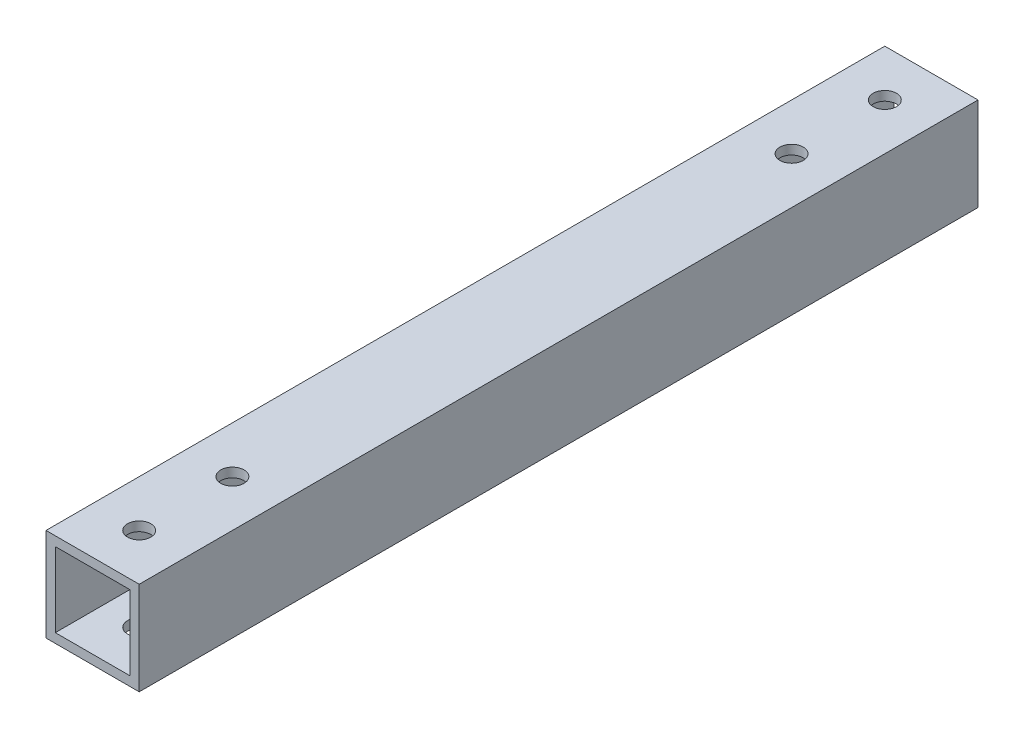
ISO-10303-21;
HEADER;
FILE_DESCRIPTION(('STEP AP214'),'2;1');
FILE_NAME('part.step','',(''),(''),'','','');
FILE_SCHEMA(('AUTOMOTIVE_DESIGN { 1 0 10303 214 1 1 1 1 }'));
ENDSEC;
DATA;
#1=APPLICATION_CONTEXT('core data for automotive mechanical design processes');
#2=APPLICATION_PROTOCOL_DEFINITION('international standard','automotive_design',2000,#1);
#3=PRODUCT_CONTEXT('',#1,'mechanical');
#4=PRODUCT('Part','Part','',(#3));
#5=PRODUCT_RELATED_PRODUCT_CATEGORY('part','',(#4));
#6=PRODUCT_DEFINITION_FORMATION('','',#4);
#7=PRODUCT_DEFINITION_CONTEXT('part definition',#1,'design');
#8=PRODUCT_DEFINITION('design','',#6,#7);
#9=PRODUCT_DEFINITION_SHAPE('','',#8);
#10=(LENGTH_UNIT() NAMED_UNIT(*) SI_UNIT(.MILLI.,.METRE.));
#11=(NAMED_UNIT(*) PLANE_ANGLE_UNIT() SI_UNIT($,.RADIAN.));
#12=(NAMED_UNIT(*) SI_UNIT($,.STERADIAN.) SOLID_ANGLE_UNIT());
#13=UNCERTAINTY_MEASURE_WITH_UNIT(LENGTH_MEASURE(1.E-05),#10,'distance_accuracy_value','');
#14=(GEOMETRIC_REPRESENTATION_CONTEXT(3) GLOBAL_UNCERTAINTY_ASSIGNED_CONTEXT((#13)) GLOBAL_UNIT_ASSIGNED_CONTEXT((#10,
#11,#12)) REPRESENTATION_CONTEXT('',''));
#15=CARTESIAN_POINT('',(0.,0.,0.));
#16=DIRECTION('',(0.,0.,1.));
#17=DIRECTION('',(1.,0.,0.));
#18=AXIS2_PLACEMENT_3D('',#15,#16,#17);
#19=CARTESIAN_POINT('',(0.,0.,180.));
#20=DIRECTION('',(0.,0.,1.));
#21=DIRECTION('',(1.,0.,0.));
#22=AXIS2_PLACEMENT_3D('',#19,#20,#21);
#23=PLANE('',#22);
#24=DIRECTION('',(0.,1.,0.));
#25=VECTOR('',#24,1.);
#26=CARTESIAN_POINT('',(10.,10.,180.));
#27=LINE('',#26,#25);
#28=CARTESIAN_POINT('',(10.,-10.,180.));
#29=VERTEX_POINT('',#28);
#30=CARTESIAN_POINT('',(10.,10.,180.));
#31=VERTEX_POINT('',#30);
#32=EDGE_CURVE('E143',#29,#31,#27,.T.);
#33=ORIENTED_EDGE('',*,*,#32,.T.);
#34=DIRECTION('',(-1.,0.,0.));
#35=VECTOR('',#34,1.);
#36=CARTESIAN_POINT('',(-10.,10.,180.));
#37=LINE('',#36,#35);
#38=CARTESIAN_POINT('',(-10.,10.,180.));
#39=VERTEX_POINT('',#38);
#40=EDGE_CURVE('E146',#31,#39,#37,.T.);
#41=ORIENTED_EDGE('',*,*,#40,.T.);
#42=DIRECTION('',(0.,-1.,0.));
#43=VECTOR('',#42,1.);
#44=CARTESIAN_POINT('',(-10.,10.,180.));
#45=LINE('',#44,#43);
#46=CARTESIAN_POINT('',(-10.,-10.,180.));
#47=VERTEX_POINT('',#46);
#48=EDGE_CURVE('E149',#39,#47,#45,.T.);
#49=ORIENTED_EDGE('',*,*,#48,.T.);
#50=DIRECTION('',(1.,0.,0.));
#51=VECTOR('',#50,1.);
#52=CARTESIAN_POINT('',(-10.,-10.,180.));
#53=LINE('',#52,#51);
#54=EDGE_CURVE('E151',#47,#29,#53,.T.);
#55=ORIENTED_EDGE('',*,*,#54,.T.);
#56=EDGE_LOOP('',(#33,#41,#49,#55));
#57=FACE_BOUND('',#56,.T.);
#58=DIRECTION('',(-1.,0.,0.));
#59=VECTOR('',#58,1.);
#60=CARTESIAN_POINT('',(-8.,8.,180.));
#61=LINE('',#60,#59);
#62=CARTESIAN_POINT('',(8.,8.,180.));
#63=VERTEX_POINT('',#62);
#64=CARTESIAN_POINT('',(-8.,8.,180.));
#65=VERTEX_POINT('',#64);
#66=EDGE_CURVE('E113',#63,#65,#61,.T.);
#67=ORIENTED_EDGE('',*,*,#66,.F.);
#68=DIRECTION('',(0.,1.,0.));
#69=VECTOR('',#68,1.);
#70=CARTESIAN_POINT('',(8.,8.,180.));
#71=LINE('',#70,#69);
#72=CARTESIAN_POINT('',(8.,-8.00000000000001,180.));
#73=VERTEX_POINT('',#72);
#74=EDGE_CURVE('E105',#73,#63,#71,.T.);
#75=ORIENTED_EDGE('',*,*,#74,.F.);
#76=DIRECTION('',(1.,0.,0.));
#77=VECTOR('',#76,1.);
#78=CARTESIAN_POINT('',(-8.,-8.00000000000001,180.));
#79=LINE('',#78,#77);
#80=CARTESIAN_POINT('',(-8.,-8.00000000000001,180.));
#81=VERTEX_POINT('',#80);
#82=EDGE_CURVE('E127',#81,#73,#79,.T.);
#83=ORIENTED_EDGE('',*,*,#82,.F.);
#84=DIRECTION('',(0.,-1.,0.));
#85=VECTOR('',#84,1.);
#86=CARTESIAN_POINT('',(-8.,8.,180.));
#87=LINE('',#86,#85);
#88=EDGE_CURVE('E125',#65,#81,#87,.T.);
#89=ORIENTED_EDGE('',*,*,#88,.F.);
#90=EDGE_LOOP('',(#67,#75,#83,#89));
#91=FACE_BOUND('',#90,.T.);
#92=ADVANCED_FACE('F38',(#57,#91),#23,.T.);
#93=CARTESIAN_POINT('',(0.,0.,0.));
#94=DIRECTION('',(0.,0.,1.));
#95=DIRECTION('',(1.,0.,0.));
#96=AXIS2_PLACEMENT_3D('',#93,#94,#95);
#97=PLANE('',#96);
#98=DIRECTION('',(0.,1.,0.));
#99=VECTOR('',#98,1.);
#100=CARTESIAN_POINT('',(10.,10.,0.));
#101=LINE('',#100,#99);
#102=CARTESIAN_POINT('',(10.,-10.,0.));
#103=VERTEX_POINT('',#102);
#104=CARTESIAN_POINT('',(10.,10.,0.));
#105=VERTEX_POINT('',#104);
#106=EDGE_CURVE('E121',#103,#105,#101,.T.);
#107=ORIENTED_EDGE('',*,*,#106,.F.);
#108=DIRECTION('',(1.,0.,0.));
#109=VECTOR('',#108,1.);
#110=CARTESIAN_POINT('',(-10.,-10.,0.));
#111=LINE('',#110,#109);
#112=CARTESIAN_POINT('',(-10.,-10.,0.));
#113=VERTEX_POINT('',#112);
#114=EDGE_CURVE('E147',#113,#103,#111,.T.);
#115=ORIENTED_EDGE('',*,*,#114,.F.);
#116=DIRECTION('',(0.,-1.,0.));
#117=VECTOR('',#116,1.);
#118=CARTESIAN_POINT('',(-10.,10.,0.));
#119=LINE('',#118,#117);
#120=CARTESIAN_POINT('',(-10.,10.,0.));
#121=VERTEX_POINT('',#120);
#122=EDGE_CURVE('E158',#121,#113,#119,.T.);
#123=ORIENTED_EDGE('',*,*,#122,.F.);
#124=DIRECTION('',(-1.,0.,0.));
#125=VECTOR('',#124,1.);
#126=CARTESIAN_POINT('',(-10.,10.,0.));
#127=LINE('',#126,#125);
#128=EDGE_CURVE('E156',#105,#121,#127,.T.);
#129=ORIENTED_EDGE('',*,*,#128,.F.);
#130=EDGE_LOOP('',(#107,#115,#123,#129));
#131=FACE_BOUND('',#130,.T.);
#132=DIRECTION('',(0.,1.,0.));
#133=VECTOR('',#132,1.);
#134=CARTESIAN_POINT('',(8.,8.,0.));
#135=LINE('',#134,#133);
#136=CARTESIAN_POINT('',(8.,-8.00000000000001,0.));
#137=VERTEX_POINT('',#136);
#138=CARTESIAN_POINT('',(8.,8.,0.));
#139=VERTEX_POINT('',#138);
#140=EDGE_CURVE('E63',#137,#139,#135,.T.);
#141=ORIENTED_EDGE('',*,*,#140,.T.);
#142=DIRECTION('',(-1.,0.,0.));
#143=VECTOR('',#142,1.);
#144=CARTESIAN_POINT('',(-8.,8.,0.));
#145=LINE('',#144,#143);
#146=CARTESIAN_POINT('',(-8.,8.,0.));
#147=VERTEX_POINT('',#146);
#148=EDGE_CURVE('E120',#139,#147,#145,.T.);
#149=ORIENTED_EDGE('',*,*,#148,.T.);
#150=DIRECTION('',(0.,-1.,0.));
#151=VECTOR('',#150,1.);
#152=CARTESIAN_POINT('',(-8.,8.,0.));
#153=LINE('',#152,#151);
#154=CARTESIAN_POINT('',(-8.,-8.00000000000001,0.));
#155=VERTEX_POINT('',#154);
#156=EDGE_CURVE('E135',#147,#155,#153,.T.);
#157=ORIENTED_EDGE('',*,*,#156,.T.);
#158=DIRECTION('',(1.,0.,0.));
#159=VECTOR('',#158,1.);
#160=CARTESIAN_POINT('',(-8.,-8.00000000000001,0.));
#161=LINE('',#160,#159);
#162=EDGE_CURVE('E114',#155,#137,#161,.T.);
#163=ORIENTED_EDGE('',*,*,#162,.T.);
#164=EDGE_LOOP('',(#141,#149,#157,#163));
#165=FACE_BOUND('',#164,.T.);
#166=ADVANCED_FACE('F210',(#131,#165),#97,.F.);
#167=CARTESIAN_POINT('',(10.,10.,180.));
#168=DIRECTION('',(-1.,0.,0.));
#169=DIRECTION('',(0.,0.,1.));
#170=AXIS2_PLACEMENT_3D('',#167,#168,#169);
#171=PLANE('',#170);
#172=ORIENTED_EDGE('',*,*,#106,.T.);
#173=DIRECTION('',(0.,0.,-1.));
#174=VECTOR('',#173,1.);
#175=CARTESIAN_POINT('',(10.,10.,180.));
#176=LINE('',#175,#174);
#177=EDGE_CURVE('E11',#31,#105,#176,.T.);
#178=ORIENTED_EDGE('',*,*,#177,.F.);
#179=ORIENTED_EDGE('',*,*,#32,.F.);
#180=DIRECTION('',(0.,0.,-1.));
#181=VECTOR('',#180,1.);
#182=CARTESIAN_POINT('',(10.,-10.,180.));
#183=LINE('',#182,#181);
#184=EDGE_CURVE('E153',#29,#103,#183,.T.);
#185=ORIENTED_EDGE('',*,*,#184,.T.);
#186=EDGE_LOOP('',(#172,#178,#179,#185));
#187=FACE_BOUND('',#186,.T.);
#188=ADVANCED_FACE('F40',(#187),#171,.F.);
#189=CARTESIAN_POINT('',(-10.,10.,180.));
#190=DIRECTION('',(0.,-1.,0.));
#191=DIRECTION('',(1.,0.,0.));
#192=AXIS2_PLACEMENT_3D('',#189,#190,#191);
#193=PLANE('',#192);
#194=CARTESIAN_POINT('',(0.,10.,10.));
#195=DIRECTION('',(0.,1.,0.));
#196=DIRECTION('',(-1.,0.,0.));
#197=AXIS2_PLACEMENT_3D('',#194,#195,#196);
#198=CIRCLE('',#197,2.5);
#199=CARTESIAN_POINT('',(-2.5,10.,10.));
#200=VERTEX_POINT('',#199);
#201=EDGE_CURVE('E248',#200,#200,#198,.T.);
#202=ORIENTED_EDGE('',*,*,#201,.F.);
#203=EDGE_LOOP('',(#202));
#204=FACE_BOUND('',#203,.T.);
#205=CARTESIAN_POINT('',(0.,10.,30.));
#206=DIRECTION('',(0.,1.,0.));
#207=DIRECTION('',(-1.,0.,0.));
#208=AXIS2_PLACEMENT_3D('',#205,#206,#207);
#209=CIRCLE('',#208,2.5);
#210=CARTESIAN_POINT('',(-2.5,10.,30.));
#211=VERTEX_POINT('',#210);
#212=EDGE_CURVE('E252',#211,#211,#209,.T.);
#213=ORIENTED_EDGE('',*,*,#212,.F.);
#214=EDGE_LOOP('',(#213));
#215=FACE_BOUND('',#214,.T.);
#216=CARTESIAN_POINT('',(0.,10.,150.));
#217=DIRECTION('',(0.,1.,0.));
#218=DIRECTION('',(1.,0.,0.));
#219=AXIS2_PLACEMENT_3D('',#216,#217,#218);
#220=CIRCLE('',#219,2.5);
#221=CARTESIAN_POINT('',(2.5,10.,150.));
#222=VERTEX_POINT('',#221);
#223=EDGE_CURVE('E256',#222,#222,#220,.T.);
#224=ORIENTED_EDGE('',*,*,#223,.F.);
#225=EDGE_LOOP('',(#224));
#226=FACE_BOUND('',#225,.T.);
#227=CARTESIAN_POINT('',(0.,10.,170.));
#228=DIRECTION('',(0.,1.,0.));
#229=DIRECTION('',(1.,0.,0.));
#230=AXIS2_PLACEMENT_3D('',#227,#228,#229);
#231=CIRCLE('',#230,2.49999999999999);
#232=CARTESIAN_POINT('',(2.49999999999999,10.,170.));
#233=VERTEX_POINT('',#232);
#234=EDGE_CURVE('E260',#233,#233,#231,.T.);
#235=ORIENTED_EDGE('',*,*,#234,.F.);
#236=EDGE_LOOP('',(#235));
#237=FACE_BOUND('',#236,.T.);
#238=ORIENTED_EDGE('',*,*,#128,.T.);
#239=DIRECTION('',(0.,0.,-1.));
#240=VECTOR('',#239,1.);
#241=CARTESIAN_POINT('',(-10.,10.,180.));
#242=LINE('',#241,#240);
#243=EDGE_CURVE('E47',#39,#121,#242,.T.);
#244=ORIENTED_EDGE('',*,*,#243,.F.);
#245=ORIENTED_EDGE('',*,*,#40,.F.);
#246=ORIENTED_EDGE('',*,*,#177,.T.);
#247=EDGE_LOOP('',(#238,#244,#245,#246));
#248=FACE_BOUND('',#247,.T.);
#249=ADVANCED_FACE('F237',(#204,#215,#226,#237,#248),#193,.F.);
#250=CARTESIAN_POINT('',(-10.,10.,180.));
#251=DIRECTION('',(1.,0.,0.));
#252=DIRECTION('',(0.,0.,-1.));
#253=AXIS2_PLACEMENT_3D('',#250,#251,#252);
#254=PLANE('',#253);
#255=ORIENTED_EDGE('',*,*,#122,.T.);
#256=DIRECTION('',(0.,0.,-1.));
#257=VECTOR('',#256,1.);
#258=CARTESIAN_POINT('',(-10.,-10.,180.));
#259=LINE('',#258,#257);
#260=EDGE_CURVE('E163',#47,#113,#259,.T.);
#261=ORIENTED_EDGE('',*,*,#260,.F.);
#262=ORIENTED_EDGE('',*,*,#48,.F.);
#263=ORIENTED_EDGE('',*,*,#243,.T.);
#264=EDGE_LOOP('',(#255,#261,#262,#263));
#265=FACE_BOUND('',#264,.T.);
#266=ADVANCED_FACE('F234',(#265),#254,.F.);
#267=CARTESIAN_POINT('',(-10.,-10.,180.));
#268=DIRECTION('',(0.,1.,0.));
#269=DIRECTION('',(0.,0.,1.));
#270=AXIS2_PLACEMENT_3D('',#267,#268,#269);
#271=PLANE('',#270);
#272=CARTESIAN_POINT('',(0.,-10.,10.));
#273=DIRECTION('',(0.,1.,0.));
#274=DIRECTION('',(-1.,0.,0.));
#275=AXIS2_PLACEMENT_3D('',#272,#273,#274);
#276=CIRCLE('',#275,2.5);
#277=CARTESIAN_POINT('',(-2.5,-10.,10.));
#278=VERTEX_POINT('',#277);
#279=EDGE_CURVE('E172',#278,#278,#276,.T.);
#280=ORIENTED_EDGE('',*,*,#279,.T.);
#281=EDGE_LOOP('',(#280));
#282=FACE_BOUND('',#281,.T.);
#283=CARTESIAN_POINT('',(0.,-10.,30.));
#284=DIRECTION('',(0.,1.,0.));
#285=DIRECTION('',(-1.,0.,0.));
#286=AXIS2_PLACEMENT_3D('',#283,#284,#285);
#287=CIRCLE('',#286,2.5);
#288=CARTESIAN_POINT('',(-2.49999999999999,-10.,30.));
#289=VERTEX_POINT('',#288);
#290=EDGE_CURVE('E282',#289,#289,#287,.T.);
#291=ORIENTED_EDGE('',*,*,#290,.T.);
#292=EDGE_LOOP('',(#291));
#293=FACE_BOUND('',#292,.T.);
#294=CARTESIAN_POINT('',(0.,-10.,150.));
#295=DIRECTION('',(0.,1.,0.));
#296=DIRECTION('',(1.,0.,0.));
#297=AXIS2_PLACEMENT_3D('',#294,#295,#296);
#298=CIRCLE('',#297,2.5);
#299=CARTESIAN_POINT('',(2.50000000000001,-10.,150.));
#300=VERTEX_POINT('',#299);
#301=EDGE_CURVE('E278',#300,#300,#298,.T.);
#302=ORIENTED_EDGE('',*,*,#301,.T.);
#303=EDGE_LOOP('',(#302));
#304=FACE_BOUND('',#303,.T.);
#305=CARTESIAN_POINT('',(0.,-10.,170.));
#306=DIRECTION('',(0.,1.,0.));
#307=DIRECTION('',(1.,0.,0.));
#308=AXIS2_PLACEMENT_3D('',#305,#306,#307);
#309=CIRCLE('',#308,2.49999999999999);
#310=CARTESIAN_POINT('',(2.5,-10.,170.));
#311=VERTEX_POINT('',#310);
#312=EDGE_CURVE('E273',#311,#311,#309,.T.);
#313=ORIENTED_EDGE('',*,*,#312,.T.);
#314=EDGE_LOOP('',(#313));
#315=FACE_BOUND('',#314,.T.);
#316=ORIENTED_EDGE('',*,*,#114,.T.);
#317=ORIENTED_EDGE('',*,*,#184,.F.);
#318=ORIENTED_EDGE('',*,*,#54,.F.);
#319=ORIENTED_EDGE('',*,*,#260,.T.);
#320=EDGE_LOOP('',(#316,#317,#318,#319));
#321=FACE_BOUND('',#320,.T.);
#322=ADVANCED_FACE('F231',(#282,#293,#304,#315,#321),#271,.F.);
#323=CARTESIAN_POINT('',(8.,8.,180.));
#324=DIRECTION('',(-1.,0.,0.));
#325=DIRECTION('',(0.,0.,1.));
#326=AXIS2_PLACEMENT_3D('',#323,#324,#325);
#327=PLANE('',#326);
#328=ORIENTED_EDGE('',*,*,#140,.F.);
#329=DIRECTION('',(0.,0.,-1.));
#330=VECTOR('',#329,1.);
#331=CARTESIAN_POINT('',(8.,-8.00000000000001,180.));
#332=LINE('',#331,#330);
#333=EDGE_CURVE('E109',#73,#137,#332,.T.);
#334=ORIENTED_EDGE('',*,*,#333,.F.);
#335=ORIENTED_EDGE('',*,*,#74,.T.);
#336=DIRECTION('',(0.,0.,-1.));
#337=VECTOR('',#336,1.);
#338=CARTESIAN_POINT('',(8.,8.,180.));
#339=LINE('',#338,#337);
#340=EDGE_CURVE('E108',#63,#139,#339,.T.);
#341=ORIENTED_EDGE('',*,*,#340,.T.);
#342=EDGE_LOOP('',(#328,#334,#335,#341));
#343=FACE_BOUND('',#342,.T.);
#344=ADVANCED_FACE('F107',(#343),#327,.T.);
#345=CARTESIAN_POINT('',(-8.,8.,180.));
#346=DIRECTION('',(0.,-1.,0.));
#347=DIRECTION('',(0.,0.,-1.));
#348=AXIS2_PLACEMENT_3D('',#345,#346,#347);
#349=PLANE('',#348);
#350=CARTESIAN_POINT('',(0.,8.00000000000001,10.));
#351=DIRECTION('',(0.,-1.,0.));
#352=DIRECTION('',(0.,0.,-1.));
#353=AXIS2_PLACEMENT_3D('',#350,#351,#352);
#354=CIRCLE('',#353,2.5);
#355=CARTESIAN_POINT('',(0.,8.00000000000001,7.5));
#356=VERTEX_POINT('',#355);
#357=EDGE_CURVE('E133',#356,#356,#354,.T.);
#358=ORIENTED_EDGE('',*,*,#357,.F.);
#359=EDGE_LOOP('',(#358));
#360=FACE_BOUND('',#359,.T.);
#361=CARTESIAN_POINT('',(0.,8.00000000000001,30.));
#362=DIRECTION('',(0.,-1.,0.));
#363=DIRECTION('',(0.,0.,-1.));
#364=AXIS2_PLACEMENT_3D('',#361,#362,#363);
#365=CIRCLE('',#364,2.5);
#366=CARTESIAN_POINT('',(0.,8.00000000000001,27.5));
#367=VERTEX_POINT('',#366);
#368=EDGE_CURVE('E178',#367,#367,#365,.T.);
#369=ORIENTED_EDGE('',*,*,#368,.F.);
#370=EDGE_LOOP('',(#369));
#371=FACE_BOUND('',#370,.T.);
#372=CARTESIAN_POINT('',(0.,8.00000000000001,150.));
#373=DIRECTION('',(0.,-1.,0.));
#374=DIRECTION('',(0.,0.,-1.));
#375=AXIS2_PLACEMENT_3D('',#372,#373,#374);
#376=CIRCLE('',#375,2.5);
#377=CARTESIAN_POINT('',(0.,8.00000000000001,147.5));
#378=VERTEX_POINT('',#377);
#379=EDGE_CURVE('E175',#378,#378,#376,.T.);
#380=ORIENTED_EDGE('',*,*,#379,.F.);
#381=EDGE_LOOP('',(#380));
#382=FACE_BOUND('',#381,.T.);
#383=CARTESIAN_POINT('',(0.,8.00000000000001,170.));
#384=DIRECTION('',(0.,-1.,0.));
#385=DIRECTION('',(0.,0.,-1.));
#386=AXIS2_PLACEMENT_3D('',#383,#384,#385);
#387=CIRCLE('',#386,2.49999999999999);
#388=CARTESIAN_POINT('',(0.,8.00000000000001,167.5));
#389=VERTEX_POINT('',#388);
#390=EDGE_CURVE('E171',#389,#389,#387,.T.);
#391=ORIENTED_EDGE('',*,*,#390,.F.);
#392=EDGE_LOOP('',(#391));
#393=FACE_BOUND('',#392,.T.);
#394=ORIENTED_EDGE('',*,*,#148,.F.);
#395=ORIENTED_EDGE('',*,*,#340,.F.);
#396=ORIENTED_EDGE('',*,*,#66,.T.);
#397=DIRECTION('',(0.,0.,-1.));
#398=VECTOR('',#397,1.);
#399=CARTESIAN_POINT('',(-8.,8.,180.));
#400=LINE('',#399,#398);
#401=EDGE_CURVE('E122',#65,#147,#400,.T.);
#402=ORIENTED_EDGE('',*,*,#401,.T.);
#403=EDGE_LOOP('',(#394,#395,#396,#402));
#404=FACE_BOUND('',#403,.T.);
#405=ADVANCED_FACE('F117',(#360,#371,#382,#393,#404),#349,.T.);
#406=CARTESIAN_POINT('',(-8.,8.,180.));
#407=DIRECTION('',(1.,0.,0.));
#408=DIRECTION('',(0.,0.,-1.));
#409=AXIS2_PLACEMENT_3D('',#406,#407,#408);
#410=PLANE('',#409);
#411=ORIENTED_EDGE('',*,*,#156,.F.);
#412=ORIENTED_EDGE('',*,*,#401,.F.);
#413=ORIENTED_EDGE('',*,*,#88,.T.);
#414=DIRECTION('',(0.,0.,-1.));
#415=VECTOR('',#414,1.);
#416=CARTESIAN_POINT('',(-8.,-8.00000000000001,180.));
#417=LINE('',#416,#415);
#418=EDGE_CURVE('E55',#81,#155,#417,.T.);
#419=ORIENTED_EDGE('',*,*,#418,.T.);
#420=EDGE_LOOP('',(#411,#412,#413,#419));
#421=FACE_BOUND('',#420,.T.);
#422=ADVANCED_FACE('F202',(#421),#410,.T.);
#423=CARTESIAN_POINT('',(-8.,-8.00000000000001,180.));
#424=DIRECTION('',(0.,1.,0.));
#425=DIRECTION('',(0.,0.,1.));
#426=AXIS2_PLACEMENT_3D('',#423,#424,#425);
#427=PLANE('',#426);
#428=CARTESIAN_POINT('',(0.,-8.00000000000001,10.));
#429=DIRECTION('',(0.,1.,0.));
#430=DIRECTION('',(0.,0.,1.));
#431=AXIS2_PLACEMENT_3D('',#428,#429,#430);
#432=CIRCLE('',#431,2.5);
#433=CARTESIAN_POINT('',(0.,-8.00000000000001,12.5));
#434=VERTEX_POINT('',#433);
#435=EDGE_CURVE('E42',#434,#434,#432,.T.);
#436=ORIENTED_EDGE('',*,*,#435,.F.);
#437=EDGE_LOOP('',(#436));
#438=FACE_BOUND('',#437,.T.);
#439=CARTESIAN_POINT('',(0.,-8.00000000000001,30.));
#440=DIRECTION('',(0.,1.,0.));
#441=DIRECTION('',(0.,0.,1.));
#442=AXIS2_PLACEMENT_3D('',#439,#440,#441);
#443=CIRCLE('',#442,2.5);
#444=CARTESIAN_POINT('',(0.,-8.00000000000001,32.5));
#445=VERTEX_POINT('',#444);
#446=EDGE_CURVE('E176',#445,#445,#443,.T.);
#447=ORIENTED_EDGE('',*,*,#446,.F.);
#448=EDGE_LOOP('',(#447));
#449=FACE_BOUND('',#448,.T.);
#450=CARTESIAN_POINT('',(0.,-8.00000000000001,150.));
#451=DIRECTION('',(0.,1.,0.));
#452=DIRECTION('',(0.,0.,1.));
#453=AXIS2_PLACEMENT_3D('',#450,#451,#452);
#454=CIRCLE('',#453,2.5);
#455=CARTESIAN_POINT('',(0.,-8.00000000000001,152.5));
#456=VERTEX_POINT('',#455);
#457=EDGE_CURVE('E173',#456,#456,#454,.T.);
#458=ORIENTED_EDGE('',*,*,#457,.F.);
#459=EDGE_LOOP('',(#458));
#460=FACE_BOUND('',#459,.T.);
#461=CARTESIAN_POINT('',(0.,-8.00000000000001,170.));
#462=DIRECTION('',(0.,1.,0.));
#463=DIRECTION('',(0.,0.,1.));
#464=AXIS2_PLACEMENT_3D('',#461,#462,#463);
#465=CIRCLE('',#464,2.49999999999999);
#466=CARTESIAN_POINT('',(0.,-8.00000000000001,172.5));
#467=VERTEX_POINT('',#466);
#468=EDGE_CURVE('E168',#467,#467,#465,.T.);
#469=ORIENTED_EDGE('',*,*,#468,.F.);
#470=EDGE_LOOP('',(#469));
#471=FACE_BOUND('',#470,.T.);
#472=ORIENTED_EDGE('',*,*,#162,.F.);
#473=ORIENTED_EDGE('',*,*,#418,.F.);
#474=ORIENTED_EDGE('',*,*,#82,.T.);
#475=ORIENTED_EDGE('',*,*,#333,.T.);
#476=EDGE_LOOP('',(#472,#473,#474,#475));
#477=FACE_BOUND('',#476,.T.);
#478=ADVANCED_FACE('F198',(#438,#449,#460,#471,#477),#427,.T.);
#479=CARTESIAN_POINT('',(0.,-10.,170.));
#480=DIRECTION('',(0.,1.,0.));
#481=DIRECTION('',(-1.,0.,0.));
#482=AXIS2_PLACEMENT_3D('',#479,#480,#481);
#483=CYLINDRICAL_SURFACE('',#482,2.49999999999999);
#484=ORIENTED_EDGE('',*,*,#468,.T.);
#485=EDGE_LOOP('',(#484));
#486=FACE_BOUND('',#485,.T.);
#487=ORIENTED_EDGE('',*,*,#312,.F.);
#488=EDGE_LOOP('',(#487));
#489=FACE_BOUND('',#488,.T.);
#490=ADVANCED_FACE('F201',(#486,#489),#483,.F.);
#491=CARTESIAN_POINT('',(0.,-10.,150.));
#492=DIRECTION('',(0.,1.,0.));
#493=DIRECTION('',(-1.,0.,0.));
#494=AXIS2_PLACEMENT_3D('',#491,#492,#493);
#495=CYLINDRICAL_SURFACE('',#494,2.5);
#496=ORIENTED_EDGE('',*,*,#457,.T.);
#497=EDGE_LOOP('',(#496));
#498=FACE_BOUND('',#497,.T.);
#499=ORIENTED_EDGE('',*,*,#301,.F.);
#500=EDGE_LOOP('',(#499));
#501=FACE_BOUND('',#500,.T.);
#502=ADVANCED_FACE('F301',(#498,#501),#495,.F.);
#503=CARTESIAN_POINT('',(0.,-10.,30.));
#504=DIRECTION('',(0.,1.,0.));
#505=DIRECTION('',(-1.,0.,0.));
#506=AXIS2_PLACEMENT_3D('',#503,#504,#505);
#507=CYLINDRICAL_SURFACE('',#506,2.5);
#508=ORIENTED_EDGE('',*,*,#446,.T.);
#509=EDGE_LOOP('',(#508));
#510=FACE_BOUND('',#509,.T.);
#511=ORIENTED_EDGE('',*,*,#290,.F.);
#512=EDGE_LOOP('',(#511));
#513=FACE_BOUND('',#512,.T.);
#514=ADVANCED_FACE('F291',(#510,#513),#507,.F.);
#515=CARTESIAN_POINT('',(0.,-10.,10.));
#516=DIRECTION('',(0.,1.,0.));
#517=DIRECTION('',(-1.,0.,0.));
#518=AXIS2_PLACEMENT_3D('',#515,#516,#517);
#519=CYLINDRICAL_SURFACE('',#518,2.5);
#520=ORIENTED_EDGE('',*,*,#435,.T.);
#521=EDGE_LOOP('',(#520));
#522=FACE_BOUND('',#521,.T.);
#523=ORIENTED_EDGE('',*,*,#279,.F.);
#524=EDGE_LOOP('',(#523));
#525=FACE_BOUND('',#524,.T.);
#526=ADVANCED_FACE('F195',(#522,#525),#519,.F.);
#527=ORIENTED_EDGE('',*,*,#390,.T.);
#528=EDGE_LOOP('',(#527));
#529=FACE_BOUND('',#528,.T.);
#530=ORIENTED_EDGE('',*,*,#234,.T.);
#531=EDGE_LOOP('',(#530));
#532=FACE_BOUND('',#531,.T.);
#533=ADVANCED_FACE('F290',(#529,#532),#483,.F.);
#534=ORIENTED_EDGE('',*,*,#379,.T.);
#535=EDGE_LOOP('',(#534));
#536=FACE_BOUND('',#535,.T.);
#537=ORIENTED_EDGE('',*,*,#223,.T.);
#538=EDGE_LOOP('',(#537));
#539=FACE_BOUND('',#538,.T.);
#540=ADVANCED_FACE('F298',(#536,#539),#495,.F.);
#541=ORIENTED_EDGE('',*,*,#368,.T.);
#542=EDGE_LOOP('',(#541));
#543=FACE_BOUND('',#542,.T.);
#544=ORIENTED_EDGE('',*,*,#212,.T.);
#545=EDGE_LOOP('',(#544));
#546=FACE_BOUND('',#545,.T.);
#547=ADVANCED_FACE('F303',(#543,#546),#507,.F.);
#548=ORIENTED_EDGE('',*,*,#357,.T.);
#549=EDGE_LOOP('',(#548));
#550=FACE_BOUND('',#549,.T.);
#551=ORIENTED_EDGE('',*,*,#201,.T.);
#552=EDGE_LOOP('',(#551));
#553=FACE_BOUND('',#552,.T.);
#554=ADVANCED_FACE('F293',(#550,#553),#519,.F.);
#555=CLOSED_SHELL('',(#92,#166,#188,#249,#266,#322,#344,#405,#422,#478,#490,#502,#514,#526,#533,
#540,#547,#554));
#556=MANIFOLD_SOLID_BREP('B2',#555);
#557=ADVANCED_BREP_SHAPE_REPRESENTATION('',(#18,#556),#14);
#558=SHAPE_DEFINITION_REPRESENTATION(#9,#557);
ENDSEC;
END-ISO-10303-21;
